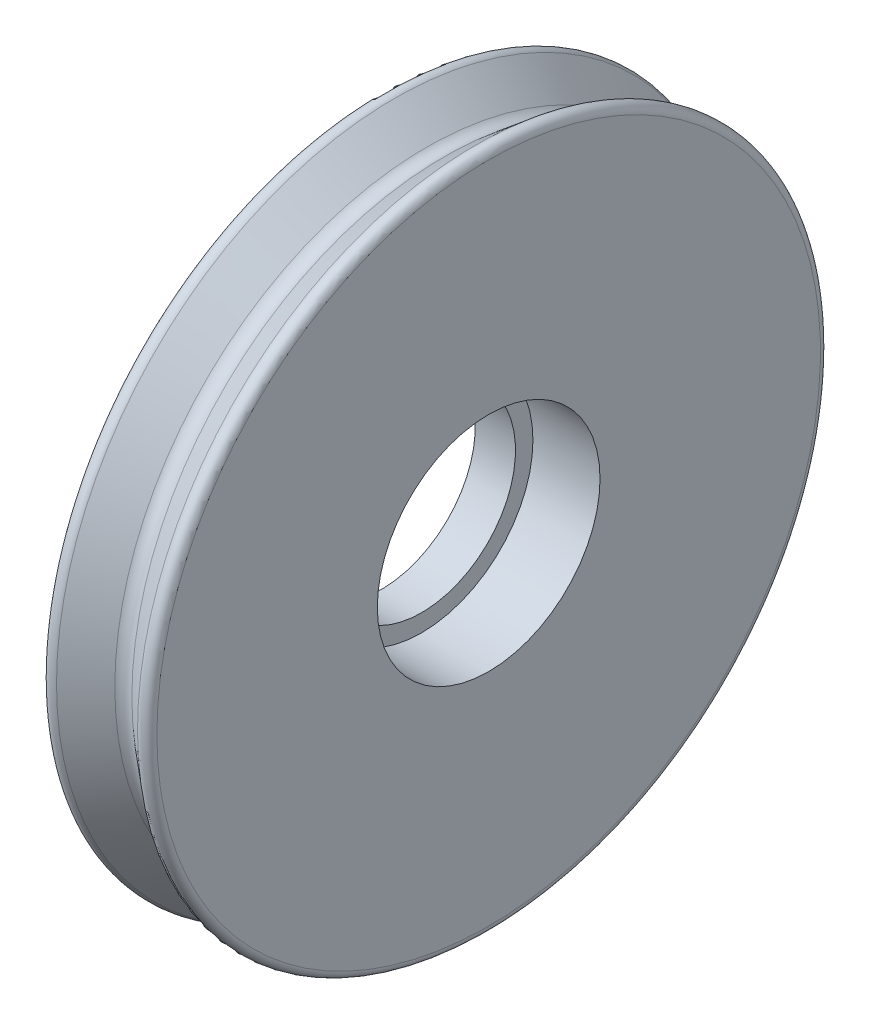
ISO-10303-21;
HEADER;
FILE_DESCRIPTION(('STEP AP214'),'2;1');
FILE_NAME('part.step','',(''),(''),'','','');
FILE_SCHEMA(('AUTOMOTIVE_DESIGN { 1 0 10303 214 1 1 1 1 }'));
ENDSEC;
DATA;
#1=APPLICATION_CONTEXT('core data for automotive mechanical design processes');
#2=APPLICATION_PROTOCOL_DEFINITION('international standard','automotive_design',2000,#1);
#3=PRODUCT_CONTEXT('',#1,'mechanical');
#4=PRODUCT('Part','Part','',(#3));
#5=PRODUCT_RELATED_PRODUCT_CATEGORY('part','',(#4));
#6=PRODUCT_DEFINITION_FORMATION('','',#4);
#7=PRODUCT_DEFINITION_CONTEXT('part definition',#1,'design');
#8=PRODUCT_DEFINITION('design','',#6,#7);
#9=PRODUCT_DEFINITION_SHAPE('','',#8);
#10=(LENGTH_UNIT() NAMED_UNIT(*) SI_UNIT(.MILLI.,.METRE.));
#11=(NAMED_UNIT(*) PLANE_ANGLE_UNIT() SI_UNIT($,.RADIAN.));
#12=(NAMED_UNIT(*) SI_UNIT($,.STERADIAN.) SOLID_ANGLE_UNIT());
#13=UNCERTAINTY_MEASURE_WITH_UNIT(LENGTH_MEASURE(1.E-05),#10,'distance_accuracy_value','');
#14=(GEOMETRIC_REPRESENTATION_CONTEXT(3) GLOBAL_UNCERTAINTY_ASSIGNED_CONTEXT((#13)) GLOBAL_UNIT_ASSIGNED_CONTEXT((#10,
#11,#12)) REPRESENTATION_CONTEXT('',''));
#15=CARTESIAN_POINT('',(0.,0.,0.));
#16=DIRECTION('',(0.,0.,1.));
#17=DIRECTION('',(1.,0.,0.));
#18=AXIS2_PLACEMENT_3D('',#15,#16,#17);
#19=CARTESIAN_POINT('',(0.,0.,0.));
#20=DIRECTION('',(-1.,0.,0.));
#21=DIRECTION('',(0.,0.,1.));
#22=AXIS2_PLACEMENT_3D('',#19,#20,#21);
#23=CYLINDRICAL_SURFACE('',#22,3.5);
#24=CARTESIAN_POINT('',(1.5,0.,0.));
#25=DIRECTION('',(-1.,0.,0.));
#26=DIRECTION('',(0.,0.,1.));
#27=AXIS2_PLACEMENT_3D('',#24,#25,#26);
#28=CIRCLE('',#27,3.5);
#29=CARTESIAN_POINT('',(1.5,0.,3.5));
#30=VERTEX_POINT('',#29);
#31=EDGE_CURVE('E52',#30,#30,#28,.T.);
#32=ORIENTED_EDGE('',*,*,#31,.F.);
#33=EDGE_LOOP('',(#32));
#34=FACE_BOUND('',#33,.T.);
#35=CARTESIAN_POINT('',(0.,0.,0.));
#36=DIRECTION('',(-1.,0.,0.));
#37=DIRECTION('',(0.,0.,1.));
#38=AXIS2_PLACEMENT_3D('',#35,#36,#37);
#39=CIRCLE('',#38,3.5);
#40=CARTESIAN_POINT('',(0.,0.,3.5));
#41=VERTEX_POINT('',#40);
#42=EDGE_CURVE('E67',#41,#41,#39,.T.);
#43=ORIENTED_EDGE('',*,*,#42,.T.);
#44=EDGE_LOOP('',(#43));
#45=FACE_BOUND('',#44,.T.);
#46=ADVANCED_FACE('F32',(#34,#45),#23,.F.);
#47=CARTESIAN_POINT('',(1.5,4.15,0.));
#48=DIRECTION('',(-1.,0.,0.));
#49=DIRECTION('',(0.,0.,1.));
#50=AXIS2_PLACEMENT_3D('',#47,#48,#49);
#51=PLANE('',#50);
#52=CARTESIAN_POINT('',(1.5,0.,0.));
#53=DIRECTION('',(-1.,0.,0.));
#54=DIRECTION('',(0.,0.,1.));
#55=AXIS2_PLACEMENT_3D('',#52,#53,#54);
#56=CIRCLE('',#55,4.15);
#57=CARTESIAN_POINT('',(1.5,0.,4.15));
#58=VERTEX_POINT('',#57);
#59=EDGE_CURVE('E55',#58,#58,#56,.T.);
#60=ORIENTED_EDGE('',*,*,#59,.F.);
#61=EDGE_LOOP('',(#60));
#62=FACE_BOUND('',#61,.T.);
#63=ORIENTED_EDGE('',*,*,#31,.T.);
#64=EDGE_LOOP('',(#63));
#65=FACE_BOUND('',#64,.T.);
#66=ADVANCED_FACE('F85',(#62,#65),#51,.F.);
#67=CARTESIAN_POINT('',(0.,0.,0.));
#68=DIRECTION('',(-1.,0.,0.));
#69=DIRECTION('',(0.,0.,1.));
#70=AXIS2_PLACEMENT_3D('',#67,#68,#69);
#71=CYLINDRICAL_SURFACE('',#70,4.15);
#72=CARTESIAN_POINT('',(4.,0.,0.));
#73=DIRECTION('',(-1.,0.,0.));
#74=DIRECTION('',(0.,0.,1.));
#75=AXIS2_PLACEMENT_3D('',#72,#73,#74);
#76=CIRCLE('',#75,4.15);
#77=CARTESIAN_POINT('',(4.,0.,4.15));
#78=VERTEX_POINT('',#77);
#79=EDGE_CURVE('E58',#78,#78,#76,.T.);
#80=ORIENTED_EDGE('',*,*,#79,.F.);
#81=EDGE_LOOP('',(#80));
#82=FACE_BOUND('',#81,.T.);
#83=ORIENTED_EDGE('',*,*,#59,.T.);
#84=EDGE_LOOP('',(#83));
#85=FACE_BOUND('',#84,.T.);
#86=ADVANCED_FACE('F91',(#82,#85),#71,.F.);
#87=CARTESIAN_POINT('',(4.,13.,0.));
#88=DIRECTION('',(-1.,0.,0.));
#89=DIRECTION('',(0.,0.,1.));
#90=AXIS2_PLACEMENT_3D('',#87,#88,#89);
#91=PLANE('',#90);
#92=CARTESIAN_POINT('',(4.,0.,0.));
#93=DIRECTION('',(-1.,0.,0.));
#94=DIRECTION('',(0.,0.,1.));
#95=AXIS2_PLACEMENT_3D('',#92,#93,#94);
#96=CIRCLE('',#95,12.3641101056459);
#97=CARTESIAN_POINT('',(4.,0.,12.3641101056459));
#98=VERTEX_POINT('',#97);
#99=EDGE_CURVE('E43',#98,#98,#96,.F.);
#100=ORIENTED_EDGE('',*,*,#99,.T.);
#101=EDGE_LOOP('',(#100));
#102=FACE_BOUND('',#101,.T.);
#103=ORIENTED_EDGE('',*,*,#79,.T.);
#104=EDGE_LOOP('',(#103));
#105=FACE_BOUND('',#104,.T.);
#106=ADVANCED_FACE('F98',(#102,#105),#91,.F.);
#107=CARTESIAN_POINT('',(4.,0.,0.));
#108=DIRECTION('',(1.,0.,0.));
#109=DIRECTION('',(0.,0.,-1.));
#110=AXIS2_PLACEMENT_3D('',#107,#108,#109);
#111=CONICAL_SURFACE('',#110,13.,0.689161014898938);
#112=CARTESIAN_POINT('',(3.50923303169378,0.,0.));
#113=DIRECTION('',(-1.,0.,0.));
#114=DIRECTION('',(0.,0.,1.));
#115=AXIS2_PLACEMENT_3D('',#112,#113,#114);
#116=CIRCLE('',#115,12.5956440422584);
#117=CARTESIAN_POINT('',(3.50923303169378,0.,12.5956440422584));
#118=VERTEX_POINT('',#117);
#119=EDGE_CURVE('E47',#118,#118,#116,.T.);
#120=ORIENTED_EDGE('',*,*,#119,.T.);
#121=EDGE_LOOP('',(#120));
#122=FACE_BOUND('',#121,.T.);
#123=CARTESIAN_POINT('',(2.31794494717703,0.,0.));
#124=DIRECTION('',(-1.,0.,0.));
#125=DIRECTION('',(0.,0.,1.));
#126=AXIS2_PLACEMENT_3D('',#123,#124,#125);
#127=CIRCLE('',#126,11.6141101056459);
#128=CARTESIAN_POINT('',(2.31794494717703,0.,11.6141101056459));
#129=VERTEX_POINT('',#128);
#130=EDGE_CURVE('E61',#129,#129,#127,.T.);
#131=ORIENTED_EDGE('',*,*,#130,.F.);
#132=EDGE_LOOP('',(#131));
#133=FACE_BOUND('',#132,.T.);
#134=ADVANCED_FACE('F102',(#122,#133),#111,.T.);
#135=CARTESIAN_POINT('',(2.,0.,0.));
#136=DIRECTION('',(-1.,0.,0.));
#137=DIRECTION('',(0.,0.,1.));
#138=AXIS2_PLACEMENT_3D('',#135,#136,#137);
#139=TOROIDAL_SURFACE('',#138,12.,0.499999999999999);
#140=CARTESIAN_POINT('',(1.68205505282297,0.,0.));
#141=DIRECTION('',(-1.,0.,0.));
#142=DIRECTION('',(0.,0.,1.));
#143=AXIS2_PLACEMENT_3D('',#140,#141,#142);
#144=CIRCLE('',#143,11.6141101056459);
#145=CARTESIAN_POINT('',(1.68205505282297,0.,11.6141101056459));
#146=VERTEX_POINT('',#145);
#147=EDGE_CURVE('E64',#146,#146,#144,.T.);
#148=ORIENTED_EDGE('',*,*,#147,.F.);
#149=EDGE_LOOP('',(#148));
#150=FACE_BOUND('',#149,.T.);
#151=ORIENTED_EDGE('',*,*,#130,.T.);
#152=EDGE_LOOP('',(#151));
#153=FACE_BOUND('',#152,.T.);
#154=ADVANCED_FACE('F82',(#150,#153),#139,.F.);
#155=CARTESIAN_POINT('',(1.68205505282297,0.,0.));
#156=DIRECTION('',(-1.,0.,0.));
#157=DIRECTION('',(0.,0.,1.));
#158=AXIS2_PLACEMENT_3D('',#155,#156,#157);
#159=CONICAL_SURFACE('',#158,11.6141101056459,0.689161014898937);
#160=CARTESIAN_POINT('',(0.49076696830622,0.,0.));
#161=DIRECTION('',(1.,0.,0.));
#162=DIRECTION('',(0.,0.,-1.));
#163=AXIS2_PLACEMENT_3D('',#160,#161,#162);
#164=CIRCLE('',#163,12.5956440422584);
#165=CARTESIAN_POINT('',(0.49076696830622,0.,-12.5956440422584));
#166=VERTEX_POINT('',#165);
#167=EDGE_CURVE('E10',#166,#166,#164,.T.);
#168=ORIENTED_EDGE('',*,*,#167,.T.);
#169=EDGE_LOOP('',(#168));
#170=FACE_BOUND('',#169,.T.);
#171=ORIENTED_EDGE('',*,*,#147,.T.);
#172=EDGE_LOOP('',(#171));
#173=FACE_BOUND('',#172,.T.);
#174=ADVANCED_FACE('F75',(#170,#173),#159,.T.);
#175=CARTESIAN_POINT('',(0.,3.5,0.));
#176=DIRECTION('',(1.,0.,0.));
#177=DIRECTION('',(0.,0.,-1.));
#178=AXIS2_PLACEMENT_3D('',#175,#176,#177);
#179=PLANE('',#178);
#180=CARTESIAN_POINT('',(0.,0.,0.));
#181=DIRECTION('',(1.,0.,0.));
#182=DIRECTION('',(0.,0.,-1.));
#183=AXIS2_PLACEMENT_3D('',#180,#181,#182);
#184=CIRCLE('',#183,12.3641101056459);
#185=CARTESIAN_POINT('',(0.,0.,-12.3641101056459));
#186=VERTEX_POINT('',#185);
#187=EDGE_CURVE('E39',#186,#186,#184,.F.);
#188=ORIENTED_EDGE('',*,*,#187,.T.);
#189=EDGE_LOOP('',(#188));
#190=FACE_BOUND('',#189,.T.);
#191=ORIENTED_EDGE('',*,*,#42,.F.);
#192=EDGE_LOOP('',(#191));
#193=FACE_BOUND('',#192,.T.);
#194=ADVANCED_FACE('F72',(#190,#193),#179,.F.);
#195=CARTESIAN_POINT('',(3.7,0.,0.));
#196=DIRECTION('',(-1.,0.,0.));
#197=DIRECTION('',(0.,0.,1.));
#198=AXIS2_PLACEMENT_3D('',#195,#196,#197);
#199=TOROIDAL_SURFACE('',#198,12.3641101056459,0.3);
#200=ORIENTED_EDGE('',*,*,#99,.F.);
#201=EDGE_LOOP('',(#200));
#202=FACE_BOUND('',#201,.T.);
#203=ORIENTED_EDGE('',*,*,#119,.F.);
#204=EDGE_LOOP('',(#203));
#205=FACE_BOUND('',#204,.T.);
#206=ADVANCED_FACE('F74',(#202,#205),#199,.T.);
#207=CARTESIAN_POINT('',(0.3,0.,0.));
#208=DIRECTION('',(1.,0.,0.));
#209=DIRECTION('',(0.,0.,-1.));
#210=AXIS2_PLACEMENT_3D('',#207,#208,#209);
#211=TOROIDAL_SURFACE('',#210,12.3641101056459,0.3);
#212=ORIENTED_EDGE('',*,*,#167,.F.);
#213=EDGE_LOOP('',(#212));
#214=FACE_BOUND('',#213,.T.);
#215=ORIENTED_EDGE('',*,*,#187,.F.);
#216=EDGE_LOOP('',(#215));
#217=FACE_BOUND('',#216,.T.);
#218=ADVANCED_FACE('F34',(#214,#217),#211,.T.);
#219=CLOSED_SHELL('',(#46,#66,#86,#106,#134,#154,#174,#194,#206,#218));
#220=MANIFOLD_SOLID_BREP('B2',#219);
#221=ADVANCED_BREP_SHAPE_REPRESENTATION('',(#18,#220),#14);
#222=SHAPE_DEFINITION_REPRESENTATION(#9,#221);
ENDSEC;
END-ISO-10303-21;
